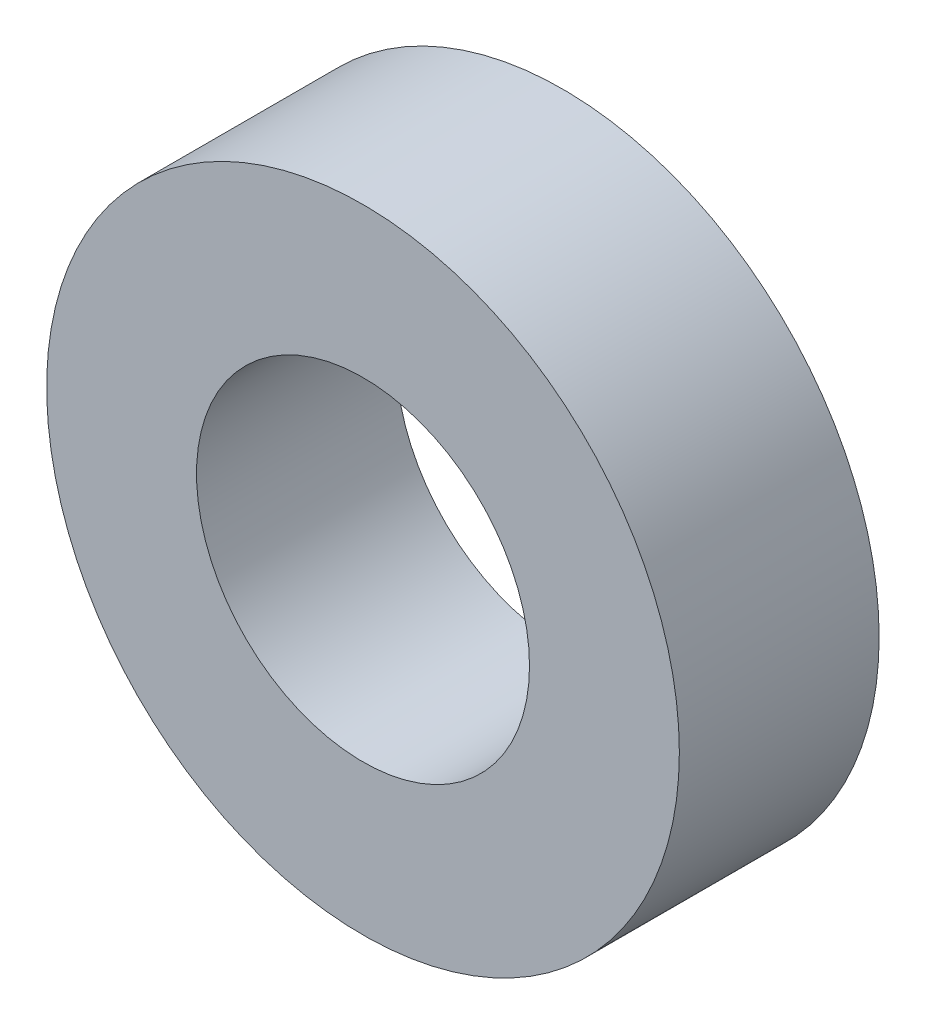
ISO-10303-21;
HEADER;
FILE_DESCRIPTION(('STEP AP214'),'2;1');
FILE_NAME('part.step','',(''),(''),'','','');
FILE_SCHEMA(('AUTOMOTIVE_DESIGN { 1 0 10303 214 1 1 1 1 }'));
ENDSEC;
DATA;
#1=APPLICATION_CONTEXT('core data for automotive mechanical design processes');
#2=APPLICATION_PROTOCOL_DEFINITION('international standard','automotive_design',2000,#1);
#3=PRODUCT_CONTEXT('',#1,'mechanical');
#4=PRODUCT('Part','Part','',(#3));
#5=PRODUCT_RELATED_PRODUCT_CATEGORY('part','',(#4));
#6=PRODUCT_DEFINITION_FORMATION('','',#4);
#7=PRODUCT_DEFINITION_CONTEXT('part definition',#1,'design');
#8=PRODUCT_DEFINITION('design','',#6,#7);
#9=PRODUCT_DEFINITION_SHAPE('','',#8);
#10=(LENGTH_UNIT() NAMED_UNIT(*) SI_UNIT(.MILLI.,.METRE.));
#11=(NAMED_UNIT(*) PLANE_ANGLE_UNIT() SI_UNIT($,.RADIAN.));
#12=(NAMED_UNIT(*) SI_UNIT($,.STERADIAN.) SOLID_ANGLE_UNIT());
#13=UNCERTAINTY_MEASURE_WITH_UNIT(LENGTH_MEASURE(1.E-05),#10,'distance_accuracy_value','');
#14=(GEOMETRIC_REPRESENTATION_CONTEXT(3) GLOBAL_UNCERTAINTY_ASSIGNED_CONTEXT((#13)) GLOBAL_UNIT_ASSIGNED_CONTEXT((#10,
#11,#12)) REPRESENTATION_CONTEXT('',''));
#15=CARTESIAN_POINT('',(0.,0.,0.));
#16=DIRECTION('',(0.,0.,1.));
#17=DIRECTION('',(1.,0.,0.));
#18=AXIS2_PLACEMENT_3D('',#15,#16,#17);
#19=CARTESIAN_POINT('',(0.,0.,3.));
#20=DIRECTION('',(0.,0.,1.));
#21=DIRECTION('',(1.,0.,0.));
#22=AXIS2_PLACEMENT_3D('',#19,#20,#21);
#23=PLANE('',#22);
#24=CARTESIAN_POINT('',(0.,0.,3.));
#25=DIRECTION('',(0.,0.,1.));
#26=DIRECTION('',(1.,0.,0.));
#27=AXIS2_PLACEMENT_3D('',#24,#25,#26);
#28=CIRCLE('',#27,9.5);
#29=CARTESIAN_POINT('',(9.5,0.,3.));
#30=VERTEX_POINT('',#29);
#31=EDGE_CURVE('E11',#30,#30,#28,.T.);
#32=ORIENTED_EDGE('',*,*,#31,.T.);
#33=EDGE_LOOP('',(#32));
#34=FACE_BOUND('',#33,.T.);
#35=CARTESIAN_POINT('',(0.,0.,3.));
#36=DIRECTION('',(0.,0.,1.));
#37=DIRECTION('',(1.,0.,0.));
#38=AXIS2_PLACEMENT_3D('',#35,#36,#37);
#39=CIRCLE('',#38,5.);
#40=CARTESIAN_POINT('',(5.,0.,3.));
#41=VERTEX_POINT('',#40);
#42=EDGE_CURVE('E56',#41,#41,#39,.T.);
#43=ORIENTED_EDGE('',*,*,#42,.F.);
#44=EDGE_LOOP('',(#43));
#45=FACE_BOUND('',#44,.T.);
#46=ADVANCED_FACE('F43',(#34,#45),#23,.T.);
#47=CARTESIAN_POINT('',(0.,0.,-3.));
#48=DIRECTION('',(0.,0.,1.));
#49=DIRECTION('',(1.,0.,0.));
#50=AXIS2_PLACEMENT_3D('',#47,#48,#49);
#51=PLANE('',#50);
#52=CARTESIAN_POINT('',(0.,0.,-3.));
#53=DIRECTION('',(0.,0.,1.));
#54=DIRECTION('',(1.,0.,0.));
#55=AXIS2_PLACEMENT_3D('',#52,#53,#54);
#56=CIRCLE('',#55,9.5);
#57=CARTESIAN_POINT('',(9.5,0.,-3.));
#58=VERTEX_POINT('',#57);
#59=EDGE_CURVE('E47',#58,#58,#56,.T.);
#60=ORIENTED_EDGE('',*,*,#59,.F.);
#61=EDGE_LOOP('',(#60));
#62=FACE_BOUND('',#61,.T.);
#63=CARTESIAN_POINT('',(0.,0.,-3.));
#64=DIRECTION('',(0.,0.,1.));
#65=DIRECTION('',(1.,0.,0.));
#66=AXIS2_PLACEMENT_3D('',#63,#64,#65);
#67=CIRCLE('',#66,5.);
#68=CARTESIAN_POINT('',(5.,0.,-3.));
#69=VERTEX_POINT('',#68);
#70=EDGE_CURVE('E58',#69,#69,#67,.T.);
#71=ORIENTED_EDGE('',*,*,#70,.T.);
#72=EDGE_LOOP('',(#71));
#73=FACE_BOUND('',#72,.T.);
#74=ADVANCED_FACE('F70',(#62,#73),#51,.F.);
#75=CARTESIAN_POINT('',(0.,0.,3.));
#76=DIRECTION('',(0.,0.,-1.));
#77=DIRECTION('',(-1.,0.,0.));
#78=AXIS2_PLACEMENT_3D('',#75,#76,#77);
#79=CYLINDRICAL_SURFACE('',#78,9.5);
#80=ORIENTED_EDGE('',*,*,#31,.F.);
#81=EDGE_LOOP('',(#80));
#82=FACE_BOUND('',#81,.T.);
#83=ORIENTED_EDGE('',*,*,#59,.T.);
#84=EDGE_LOOP('',(#83));
#85=FACE_BOUND('',#84,.T.);
#86=ADVANCED_FACE('F45',(#82,#85),#79,.T.);
#87=CARTESIAN_POINT('',(0.,0.,3.));
#88=DIRECTION('',(0.,0.,-1.));
#89=DIRECTION('',(-1.,0.,0.));
#90=AXIS2_PLACEMENT_3D('',#87,#88,#89);
#91=CYLINDRICAL_SURFACE('',#90,5.);
#92=ORIENTED_EDGE('',*,*,#42,.T.);
#93=EDGE_LOOP('',(#92));
#94=FACE_BOUND('',#93,.T.);
#95=ORIENTED_EDGE('',*,*,#70,.F.);
#96=EDGE_LOOP('',(#95));
#97=FACE_BOUND('',#96,.T.);
#98=ADVANCED_FACE('F66',(#94,#97),#91,.F.);
#99=CLOSED_SHELL('',(#46,#74,#86,#98));
#100=MANIFOLD_SOLID_BREP('B2',#99);
#101=ADVANCED_BREP_SHAPE_REPRESENTATION('',(#18,#100),#14);
#102=SHAPE_DEFINITION_REPRESENTATION(#9,#101);
ENDSEC;
END-ISO-10303-21;
